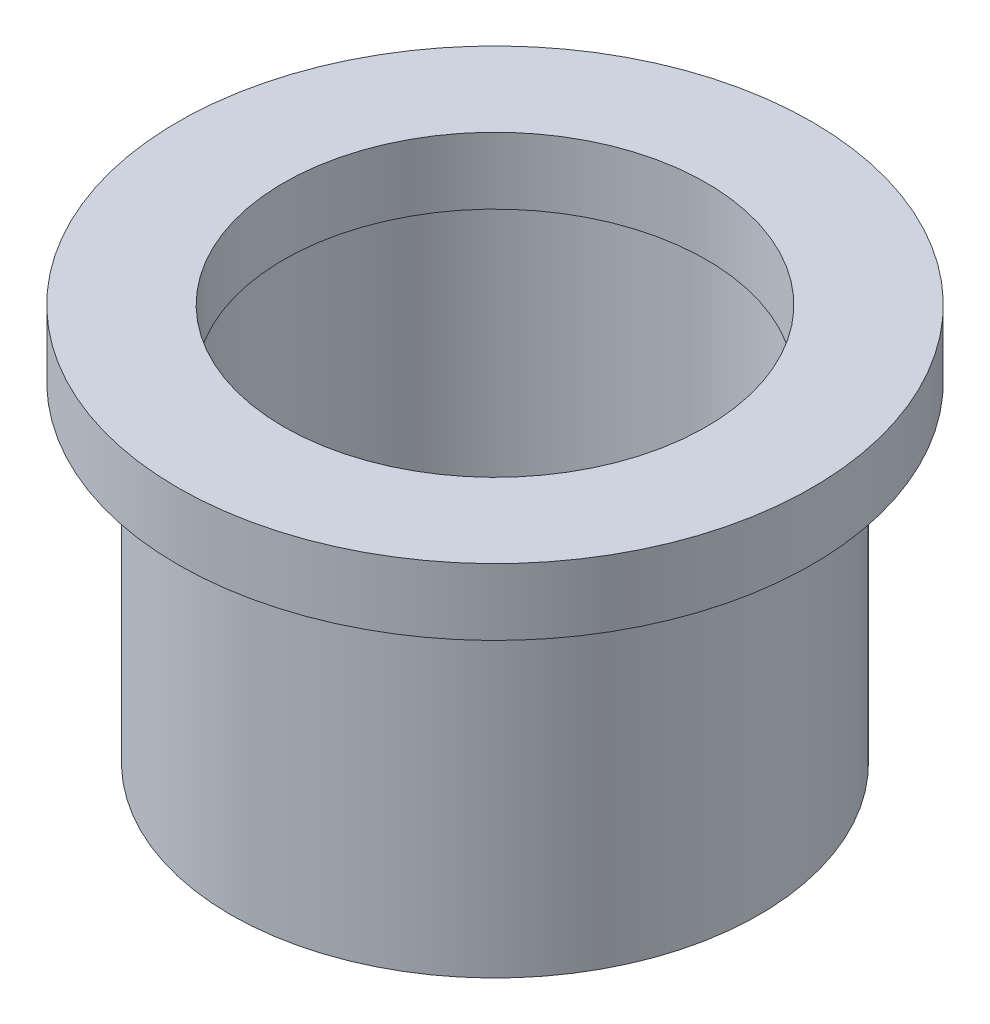
ISO-10303-21;
HEADER;
FILE_DESCRIPTION(('STEP AP214'),'2;1');
FILE_NAME('part.step','',(''),(''),'','','');
FILE_SCHEMA(('AUTOMOTIVE_DESIGN { 1 0 10303 214 1 1 1 1 }'));
ENDSEC;
DATA;
#1=APPLICATION_CONTEXT('core data for automotive mechanical design processes');
#2=APPLICATION_PROTOCOL_DEFINITION('international standard','automotive_design',2000,#1);
#3=PRODUCT_CONTEXT('',#1,'mechanical');
#4=PRODUCT('Part','Part','',(#3));
#5=PRODUCT_RELATED_PRODUCT_CATEGORY('part','',(#4));
#6=PRODUCT_DEFINITION_FORMATION('','',#4);
#7=PRODUCT_DEFINITION_CONTEXT('part definition',#1,'design');
#8=PRODUCT_DEFINITION('design','',#6,#7);
#9=PRODUCT_DEFINITION_SHAPE('','',#8);
#10=(LENGTH_UNIT() NAMED_UNIT(*) SI_UNIT(.MILLI.,.METRE.));
#11=(NAMED_UNIT(*) PLANE_ANGLE_UNIT() SI_UNIT($,.RADIAN.));
#12=(NAMED_UNIT(*) SI_UNIT($,.STERADIAN.) SOLID_ANGLE_UNIT());
#13=UNCERTAINTY_MEASURE_WITH_UNIT(LENGTH_MEASURE(1.E-05),#10,'distance_accuracy_value','');
#14=(GEOMETRIC_REPRESENTATION_CONTEXT(3) GLOBAL_UNCERTAINTY_ASSIGNED_CONTEXT((#13)) GLOBAL_UNIT_ASSIGNED_CONTEXT((#10,
#11,#12)) REPRESENTATION_CONTEXT('',''));
#15=CARTESIAN_POINT('',(0.,0.,0.));
#16=DIRECTION('',(0.,0.,1.));
#17=DIRECTION('',(1.,0.,0.));
#18=AXIS2_PLACEMENT_3D('',#15,#16,#17);
#19=CARTESIAN_POINT('',(4.7625,-3.14390757893373,0.));
#20=DIRECTION('',(0.,-1.,0.));
#21=DIRECTION('',(0.,0.,-1.));
#22=AXIS2_PLACEMENT_3D('',#19,#20,#21);
#23=PLANE('',#22);
#24=CARTESIAN_POINT('',(0.,-3.14390757893373,0.));
#25=DIRECTION('',(0.,1.,0.));
#26=DIRECTION('',(0.,0.,1.));
#27=AXIS2_PLACEMENT_3D('',#24,#25,#26);
#28=CIRCLE('',#27,3.175);
#29=CARTESIAN_POINT('',(0.,-3.14390757893373,3.175));
#30=VERTEX_POINT('',#29);
#31=EDGE_CURVE('E10',#30,#30,#28,.T.);
#32=ORIENTED_EDGE('',*,*,#31,.F.);
#33=EDGE_LOOP('',(#32));
#34=FACE_BOUND('',#33,.T.);
#35=CARTESIAN_POINT('',(0.,-3.14390757893373,0.));
#36=DIRECTION('',(0.,1.,0.));
#37=DIRECTION('',(0.,0.,1.));
#38=AXIS2_PLACEMENT_3D('',#35,#36,#37);
#39=CIRCLE('',#38,4.7625);
#40=CARTESIAN_POINT('',(0.,-3.14390757893373,4.7625));
#41=VERTEX_POINT('',#40);
#42=EDGE_CURVE('E62',#41,#41,#39,.T.);
#43=ORIENTED_EDGE('',*,*,#42,.T.);
#44=EDGE_LOOP('',(#43));
#45=FACE_BOUND('',#44,.T.);
#46=ADVANCED_FACE('F34',(#34,#45),#23,.F.);
#47=CARTESIAN_POINT('',(0.,0.,0.));
#48=DIRECTION('',(0.,1.,0.));
#49=DIRECTION('',(0.,0.,1.));
#50=AXIS2_PLACEMENT_3D('',#47,#48,#49);
#51=CYLINDRICAL_SURFACE('',#50,3.175);
#52=CARTESIAN_POINT('',(0.,-4.14390757893373,0.));
#53=DIRECTION('',(0.,1.,0.));
#54=DIRECTION('',(0.,0.,1.));
#55=AXIS2_PLACEMENT_3D('',#52,#53,#54);
#56=CIRCLE('',#55,3.175);
#57=CARTESIAN_POINT('',(0.,-4.14390757893373,3.175));
#58=VERTEX_POINT('',#57);
#59=EDGE_CURVE('E40',#58,#58,#56,.T.);
#60=ORIENTED_EDGE('',*,*,#59,.F.);
#61=EDGE_LOOP('',(#60));
#62=FACE_BOUND('',#61,.T.);
#63=ORIENTED_EDGE('',*,*,#31,.T.);
#64=EDGE_LOOP('',(#63));
#65=FACE_BOUND('',#64,.T.);
#66=ADVANCED_FACE('F99',(#62,#65),#51,.F.);
#67=CARTESIAN_POINT('',(3.175,-4.14390757893373,0.));
#68=DIRECTION('',(0.,1.,0.));
#69=DIRECTION('',(0.,0.,1.));
#70=AXIS2_PLACEMENT_3D('',#67,#68,#69);
#71=PLANE('',#70);
#72=CARTESIAN_POINT('',(0.,-4.14390757893373,0.));
#73=DIRECTION('',(0.,1.,0.));
#74=DIRECTION('',(0.,0.,1.));
#75=AXIS2_PLACEMENT_3D('',#72,#73,#74);
#76=CIRCLE('',#75,3.21875);
#77=CARTESIAN_POINT('',(0.,-4.14390757893373,3.21875));
#78=VERTEX_POINT('',#77);
#79=EDGE_CURVE('E44',#78,#78,#76,.T.);
#80=ORIENTED_EDGE('',*,*,#79,.F.);
#81=EDGE_LOOP('',(#80));
#82=FACE_BOUND('',#81,.T.);
#83=ORIENTED_EDGE('',*,*,#59,.T.);
#84=EDGE_LOOP('',(#83));
#85=FACE_BOUND('',#84,.T.);
#86=ADVANCED_FACE('F94',(#82,#85),#71,.F.);
#87=CARTESIAN_POINT('',(0.,0.,0.));
#88=DIRECTION('',(0.,1.,0.));
#89=DIRECTION('',(0.,0.,1.));
#90=AXIS2_PLACEMENT_3D('',#87,#88,#89);
#91=CYLINDRICAL_SURFACE('',#90,3.21875);
#92=CARTESIAN_POINT('',(0.,-9.09703257893373,0.));
#93=DIRECTION('',(0.,1.,0.));
#94=DIRECTION('',(0.,0.,1.));
#95=AXIS2_PLACEMENT_3D('',#92,#93,#94);
#96=CIRCLE('',#95,3.21875);
#97=CARTESIAN_POINT('',(0.,-9.09703257893373,3.21875));
#98=VERTEX_POINT('',#97);
#99=EDGE_CURVE('E48',#98,#98,#96,.T.);
#100=ORIENTED_EDGE('',*,*,#99,.F.);
#101=EDGE_LOOP('',(#100));
#102=FACE_BOUND('',#101,.T.);
#103=ORIENTED_EDGE('',*,*,#79,.T.);
#104=EDGE_LOOP('',(#103));
#105=FACE_BOUND('',#104,.T.);
#106=ADVANCED_FACE('F88',(#102,#105),#91,.F.);
#107=CARTESIAN_POINT('',(3.21875,-9.09703257893373,0.));
#108=DIRECTION('',(0.,1.,0.));
#109=DIRECTION('',(0.,0.,1.));
#110=AXIS2_PLACEMENT_3D('',#107,#108,#109);
#111=PLANE('',#110);
#112=CARTESIAN_POINT('',(0.,-9.09703257893373,0.));
#113=DIRECTION('',(0.,1.,0.));
#114=DIRECTION('',(0.,0.,1.));
#115=AXIS2_PLACEMENT_3D('',#112,#113,#114);
#116=CIRCLE('',#115,3.96875);
#117=CARTESIAN_POINT('',(0.,-9.09703257893373,3.96875));
#118=VERTEX_POINT('',#117);
#119=EDGE_CURVE('E53',#118,#118,#116,.T.);
#120=ORIENTED_EDGE('',*,*,#119,.F.);
#121=EDGE_LOOP('',(#120));
#122=FACE_BOUND('',#121,.T.);
#123=ORIENTED_EDGE('',*,*,#99,.T.);
#124=EDGE_LOOP('',(#123));
#125=FACE_BOUND('',#124,.T.);
#126=ADVANCED_FACE('F82',(#122,#125),#111,.F.);
#127=CARTESIAN_POINT('',(0.,0.,0.));
#128=DIRECTION('',(0.,1.,0.));
#129=DIRECTION('',(0.,0.,1.));
#130=AXIS2_PLACEMENT_3D('',#127,#128,#129);
#131=CYLINDRICAL_SURFACE('',#130,3.96875);
#132=CARTESIAN_POINT('',(0.,-4.14390757893373,0.));
#133=DIRECTION('',(0.,1.,0.));
#134=DIRECTION('',(0.,0.,1.));
#135=AXIS2_PLACEMENT_3D('',#132,#133,#134);
#136=CIRCLE('',#135,3.96875);
#137=CARTESIAN_POINT('',(0.,-4.14390757893373,3.96875));
#138=VERTEX_POINT('',#137);
#139=EDGE_CURVE('E56',#138,#138,#136,.T.);
#140=ORIENTED_EDGE('',*,*,#139,.F.);
#141=EDGE_LOOP('',(#140));
#142=FACE_BOUND('',#141,.T.);
#143=ORIENTED_EDGE('',*,*,#119,.T.);
#144=EDGE_LOOP('',(#143));
#145=FACE_BOUND('',#144,.T.);
#146=ADVANCED_FACE('F76',(#142,#145),#131,.T.);
#147=CARTESIAN_POINT('',(3.96875,-4.14390757893373,0.));
#148=DIRECTION('',(0.,1.,0.));
#149=DIRECTION('',(0.,0.,1.));
#150=AXIS2_PLACEMENT_3D('',#147,#148,#149);
#151=PLANE('',#150);
#152=CARTESIAN_POINT('',(0.,-4.14390757893373,0.));
#153=DIRECTION('',(0.,1.,0.));
#154=DIRECTION('',(0.,0.,1.));
#155=AXIS2_PLACEMENT_3D('',#152,#153,#154);
#156=CIRCLE('',#155,4.7625);
#157=CARTESIAN_POINT('',(0.,-4.14390757893373,4.7625));
#158=VERTEX_POINT('',#157);
#159=EDGE_CURVE('E59',#158,#158,#156,.T.);
#160=ORIENTED_EDGE('',*,*,#159,.F.);
#161=EDGE_LOOP('',(#160));
#162=FACE_BOUND('',#161,.T.);
#163=ORIENTED_EDGE('',*,*,#139,.T.);
#164=EDGE_LOOP('',(#163));
#165=FACE_BOUND('',#164,.T.);
#166=ADVANCED_FACE('F70',(#162,#165),#151,.F.);
#167=CARTESIAN_POINT('',(0.,0.,0.));
#168=DIRECTION('',(0.,1.,0.));
#169=DIRECTION('',(0.,0.,1.));
#170=AXIS2_PLACEMENT_3D('',#167,#168,#169);
#171=CYLINDRICAL_SURFACE('',#170,4.7625);
#172=ORIENTED_EDGE('',*,*,#42,.F.);
#173=EDGE_LOOP('',(#172));
#174=FACE_BOUND('',#173,.T.);
#175=ORIENTED_EDGE('',*,*,#159,.T.);
#176=EDGE_LOOP('',(#175));
#177=FACE_BOUND('',#176,.T.);
#178=ADVANCED_FACE('F67',(#174,#177),#171,.T.);
#179=CLOSED_SHELL('',(#46,#66,#86,#106,#126,#146,#166,#178));
#180=MANIFOLD_SOLID_BREP('B2',#179);
#181=ADVANCED_BREP_SHAPE_REPRESENTATION('',(#18,#180),#14);
#182=SHAPE_DEFINITION_REPRESENTATION(#9,#181);
ENDSEC;
END-ISO-10303-21;
